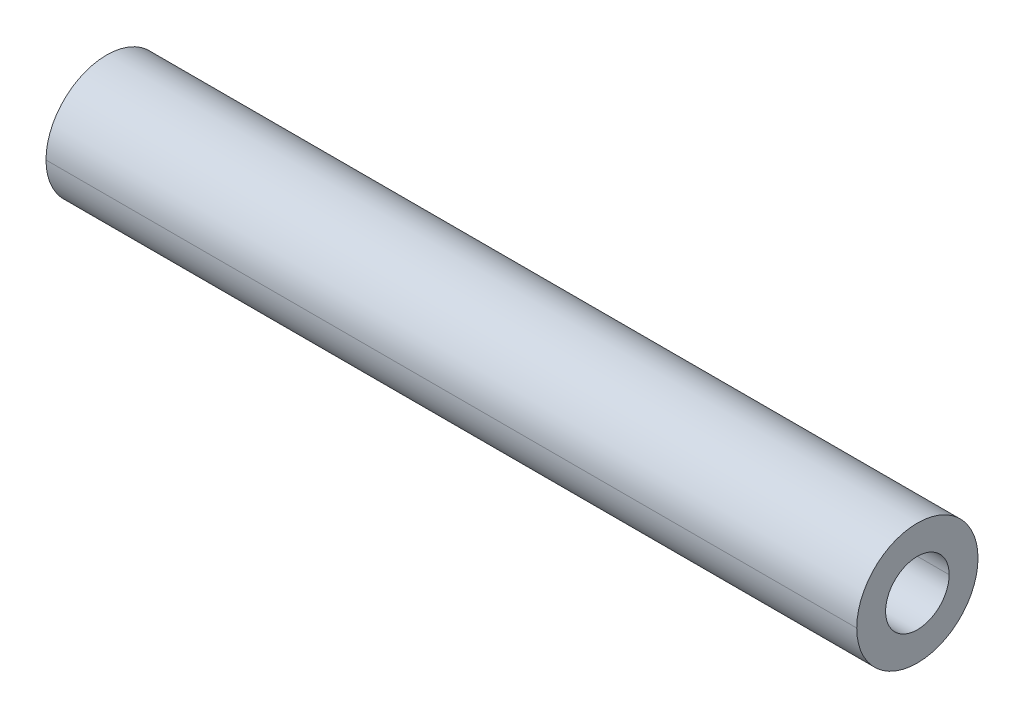
ISO-10303-21;
HEADER;
FILE_DESCRIPTION(('STEP AP214'),'2;1');
FILE_NAME('part.step','',(''),(''),'','','');
FILE_SCHEMA(('AUTOMOTIVE_DESIGN { 1 0 10303 214 1 1 1 1 }'));
ENDSEC;
DATA;
#1=APPLICATION_CONTEXT('core data for automotive mechanical design processes');
#2=APPLICATION_PROTOCOL_DEFINITION('international standard','automotive_design',2000,#1);
#3=PRODUCT_CONTEXT('',#1,'mechanical');
#4=PRODUCT('Part','Part','',(#3));
#5=PRODUCT_RELATED_PRODUCT_CATEGORY('part','',(#4));
#6=PRODUCT_DEFINITION_FORMATION('','',#4);
#7=PRODUCT_DEFINITION_CONTEXT('part definition',#1,'design');
#8=PRODUCT_DEFINITION('design','',#6,#7);
#9=PRODUCT_DEFINITION_SHAPE('','',#8);
#10=(LENGTH_UNIT() NAMED_UNIT(*) SI_UNIT(.MILLI.,.METRE.));
#11=(NAMED_UNIT(*) PLANE_ANGLE_UNIT() SI_UNIT($,.RADIAN.));
#12=(NAMED_UNIT(*) SI_UNIT($,.STERADIAN.) SOLID_ANGLE_UNIT());
#13=UNCERTAINTY_MEASURE_WITH_UNIT(LENGTH_MEASURE(1.E-05),#10,'distance_accuracy_value','');
#14=(GEOMETRIC_REPRESENTATION_CONTEXT(3) GLOBAL_UNCERTAINTY_ASSIGNED_CONTEXT((#13)) GLOBAL_UNIT_ASSIGNED_CONTEXT((#10,
#11,#12)) REPRESENTATION_CONTEXT('',''));
#15=CARTESIAN_POINT('',(0.,0.,0.));
#16=DIRECTION('',(0.,0.,1.));
#17=DIRECTION('',(1.,0.,0.));
#18=AXIS2_PLACEMENT_3D('',#15,#16,#17);
#19=CARTESIAN_POINT('',(31.75,0.,0.));
#20=DIRECTION('',(-1.,0.,0.));
#21=DIRECTION('',(0.,0.,1.));
#22=AXIS2_PLACEMENT_3D('',#19,#20,#21);
#23=CYLINDRICAL_SURFACE('',#22,2.4892);
#24=DIRECTION('',(-1.,0.,0.));
#25=VECTOR('',#24,1.);
#26=CARTESIAN_POINT('',(31.75,0.,-2.4892));
#27=LINE('',#26,#25);
#28=CARTESIAN_POINT('',(31.75,0.,-2.4892));
#29=VERTEX_POINT('',#28);
#30=CARTESIAN_POINT('',(-31.75,0.,-2.4892));
#31=VERTEX_POINT('',#30);
#32=EDGE_CURVE('E101',#29,#31,#27,.T.);
#33=ORIENTED_EDGE('',*,*,#32,.F.);
#34=CARTESIAN_POINT('',(31.75,0.,0.));
#35=DIRECTION('',(1.,0.,0.));
#36=DIRECTION('',(0.,0.,-1.));
#37=AXIS2_PLACEMENT_3D('',#34,#35,#36);
#38=CIRCLE('',#37,2.4892);
#39=CARTESIAN_POINT('',(31.75,0.,2.4892));
#40=VERTEX_POINT('',#39);
#41=EDGE_CURVE('E75',#29,#40,#38,.T.);
#42=ORIENTED_EDGE('',*,*,#41,.T.);
#43=DIRECTION('',(-1.,0.,0.));
#44=VECTOR('',#43,1.);
#45=CARTESIAN_POINT('',(31.75,0.,2.4892));
#46=LINE('',#45,#44);
#47=CARTESIAN_POINT('',(-31.75,0.,2.4892));
#48=VERTEX_POINT('',#47);
#49=EDGE_CURVE('E87',#40,#48,#46,.T.);
#50=ORIENTED_EDGE('',*,*,#49,.T.);
#51=CARTESIAN_POINT('',(-31.75,0.,0.));
#52=DIRECTION('',(1.,0.,0.));
#53=DIRECTION('',(0.,0.,-1.));
#54=AXIS2_PLACEMENT_3D('',#51,#52,#53);
#55=CIRCLE('',#54,2.4892);
#56=EDGE_CURVE('E11',#31,#48,#55,.T.);
#57=ORIENTED_EDGE('',*,*,#56,.F.);
#58=EDGE_LOOP('',(#33,#42,#50,#57));
#59=FACE_BOUND('',#58,.T.);
#60=ADVANCED_FACE('F17',(#59),#23,.F.);
#61=CARTESIAN_POINT('',(31.75,0.,0.));
#62=DIRECTION('',(-1.,0.,0.));
#63=DIRECTION('',(0.,0.,1.));
#64=AXIS2_PLACEMENT_3D('',#61,#62,#63);
#65=CYLINDRICAL_SURFACE('',#64,4.7498);
#66=DIRECTION('',(-1.,0.,0.));
#67=VECTOR('',#66,1.);
#68=CARTESIAN_POINT('',(31.75,0.,-4.7498));
#69=LINE('',#68,#67);
#70=CARTESIAN_POINT('',(31.75,0.,-4.7498));
#71=VERTEX_POINT('',#70);
#72=CARTESIAN_POINT('',(-31.75,0.,-4.7498));
#73=VERTEX_POINT('',#72);
#74=EDGE_CURVE('E79',#71,#73,#69,.T.);
#75=ORIENTED_EDGE('',*,*,#74,.F.);
#76=CARTESIAN_POINT('',(31.75,0.,0.));
#77=DIRECTION('',(1.,0.,0.));
#78=DIRECTION('',(0.,0.,-1.));
#79=AXIS2_PLACEMENT_3D('',#76,#77,#78);
#80=CIRCLE('',#79,4.7498);
#81=CARTESIAN_POINT('',(31.75,0.,4.7498));
#82=VERTEX_POINT('',#81);
#83=EDGE_CURVE('E67',#82,#71,#80,.T.);
#84=ORIENTED_EDGE('',*,*,#83,.F.);
#85=DIRECTION('',(-1.,0.,0.));
#86=VECTOR('',#85,1.);
#87=CARTESIAN_POINT('',(31.75,0.,4.7498));
#88=LINE('',#87,#86);
#89=CARTESIAN_POINT('',(-31.75,0.,4.7498));
#90=VERTEX_POINT('',#89);
#91=EDGE_CURVE('E76',#82,#90,#88,.T.);
#92=ORIENTED_EDGE('',*,*,#91,.T.);
#93=CARTESIAN_POINT('',(-31.75,0.,0.));
#94=DIRECTION('',(1.,0.,0.));
#95=DIRECTION('',(0.,0.,-1.));
#96=AXIS2_PLACEMENT_3D('',#93,#94,#95);
#97=CIRCLE('',#96,4.7498);
#98=EDGE_CURVE('E28',#90,#73,#97,.T.);
#99=ORIENTED_EDGE('',*,*,#98,.T.);
#100=EDGE_LOOP('',(#75,#84,#92,#99));
#101=FACE_BOUND('',#100,.T.);
#102=ADVANCED_FACE('F80',(#101),#65,.T.);
#103=CARTESIAN_POINT('',(-31.75,0.,0.));
#104=DIRECTION('',(1.,0.,0.));
#105=DIRECTION('',(0.,1.,0.));
#106=AXIS2_PLACEMENT_3D('',#103,#104,#105);
#107=PLANE('',#106);
#108=CARTESIAN_POINT('',(-31.75,0.,0.));
#109=DIRECTION('',(1.,0.,0.));
#110=DIRECTION('',(0.,0.,-1.));
#111=AXIS2_PLACEMENT_3D('',#108,#109,#110);
#112=CIRCLE('',#111,2.4892);
#113=EDGE_CURVE('E94',#48,#31,#112,.T.);
#114=ORIENTED_EDGE('',*,*,#113,.T.);
#115=ORIENTED_EDGE('',*,*,#56,.T.);
#116=EDGE_LOOP('',(#114,#115));
#117=FACE_BOUND('',#116,.T.);
#118=ORIENTED_EDGE('',*,*,#98,.F.);
#119=CARTESIAN_POINT('',(-31.75,0.,0.));
#120=DIRECTION('',(1.,0.,0.));
#121=DIRECTION('',(0.,0.,-1.));
#122=AXIS2_PLACEMENT_3D('',#119,#120,#121);
#123=CIRCLE('',#122,4.7498);
#124=EDGE_CURVE('E21',#73,#90,#123,.T.);
#125=ORIENTED_EDGE('',*,*,#124,.F.);
#126=EDGE_LOOP('',(#118,#125));
#127=FACE_BOUND('',#126,.T.);
#128=ADVANCED_FACE('F114',(#117,#127),#107,.F.);
#129=CARTESIAN_POINT('',(31.75,0.,0.));
#130=DIRECTION('',(1.,0.,0.));
#131=DIRECTION('',(0.,1.,0.));
#132=AXIS2_PLACEMENT_3D('',#129,#130,#131);
#133=PLANE('',#132);
#134=CARTESIAN_POINT('',(31.75,0.,0.));
#135=DIRECTION('',(1.,0.,0.));
#136=DIRECTION('',(0.,0.,-1.));
#137=AXIS2_PLACEMENT_3D('',#134,#135,#136);
#138=CIRCLE('',#137,2.4892);
#139=EDGE_CURVE('E105',#40,#29,#138,.T.);
#140=ORIENTED_EDGE('',*,*,#139,.F.);
#141=ORIENTED_EDGE('',*,*,#41,.F.);
#142=EDGE_LOOP('',(#140,#141));
#143=FACE_BOUND('',#142,.T.);
#144=ORIENTED_EDGE('',*,*,#83,.T.);
#145=CARTESIAN_POINT('',(31.75,0.,0.));
#146=DIRECTION('',(1.,0.,0.));
#147=DIRECTION('',(0.,0.,-1.));
#148=AXIS2_PLACEMENT_3D('',#145,#146,#147);
#149=CIRCLE('',#148,4.7498);
#150=EDGE_CURVE('E71',#71,#82,#149,.T.);
#151=ORIENTED_EDGE('',*,*,#150,.T.);
#152=EDGE_LOOP('',(#144,#151));
#153=FACE_BOUND('',#152,.T.);
#154=ADVANCED_FACE('F69',(#143,#153),#133,.T.);
#155=CARTESIAN_POINT('',(31.75,0.,0.));
#156=DIRECTION('',(-1.,0.,0.));
#157=DIRECTION('',(0.,0.,1.));
#158=AXIS2_PLACEMENT_3D('',#155,#156,#157);
#159=CYLINDRICAL_SURFACE('',#158,4.7498);
#160=ORIENTED_EDGE('',*,*,#150,.F.);
#161=ORIENTED_EDGE('',*,*,#74,.T.);
#162=ORIENTED_EDGE('',*,*,#124,.T.);
#163=ORIENTED_EDGE('',*,*,#91,.F.);
#164=EDGE_LOOP('',(#160,#161,#162,#163));
#165=FACE_BOUND('',#164,.T.);
#166=ADVANCED_FACE('F85',(#165),#159,.T.);
#167=CARTESIAN_POINT('',(31.75,0.,0.));
#168=DIRECTION('',(-1.,0.,0.));
#169=DIRECTION('',(0.,0.,1.));
#170=AXIS2_PLACEMENT_3D('',#167,#168,#169);
#171=CYLINDRICAL_SURFACE('',#170,2.4892);
#172=ORIENTED_EDGE('',*,*,#139,.T.);
#173=ORIENTED_EDGE('',*,*,#32,.T.);
#174=ORIENTED_EDGE('',*,*,#113,.F.);
#175=ORIENTED_EDGE('',*,*,#49,.F.);
#176=EDGE_LOOP('',(#172,#173,#174,#175));
#177=FACE_BOUND('',#176,.T.);
#178=ADVANCED_FACE('F19',(#177),#171,.F.);
#179=CLOSED_SHELL('',(#60,#102,#128,#154,#166,#178));
#180=MANIFOLD_SOLID_BREP('B1',#179);
#181=ADVANCED_BREP_SHAPE_REPRESENTATION('',(#18,#180),#14);
#182=SHAPE_DEFINITION_REPRESENTATION(#9,#181);
ENDSEC;
END-ISO-10303-21;
